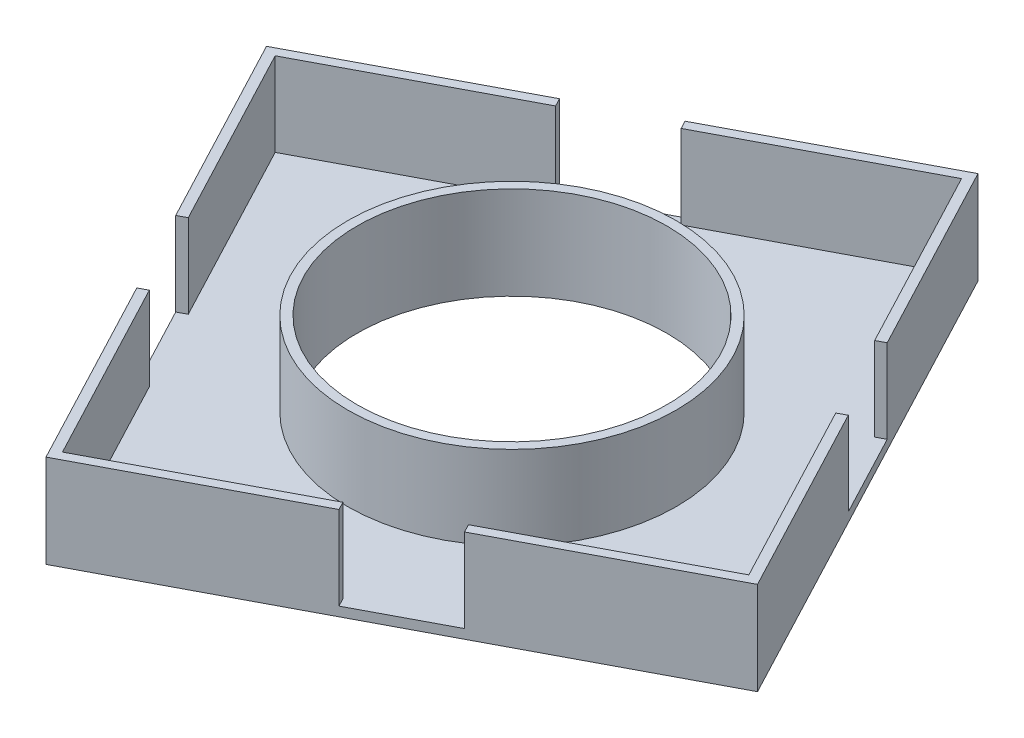
ISO-10303-21;
HEADER;
FILE_DESCRIPTION(('STEP AP214'),'2;1');
FILE_NAME('part.step','',(''),(''),'','','');
FILE_SCHEMA(('AUTOMOTIVE_DESIGN { 1 0 10303 214 1 1 1 1 }'));
ENDSEC;
DATA;
#1=APPLICATION_CONTEXT('core data for automotive mechanical design processes');
#2=APPLICATION_PROTOCOL_DEFINITION('international standard','automotive_design',2000,#1);
#3=PRODUCT_CONTEXT('',#1,'mechanical');
#4=PRODUCT('Part','Part','',(#3));
#5=PRODUCT_RELATED_PRODUCT_CATEGORY('part','',(#4));
#6=PRODUCT_DEFINITION_FORMATION('','',#4);
#7=PRODUCT_DEFINITION_CONTEXT('part definition',#1,'design');
#8=PRODUCT_DEFINITION('design','',#6,#7);
#9=PRODUCT_DEFINITION_SHAPE('','',#8);
#10=(LENGTH_UNIT() NAMED_UNIT(*) SI_UNIT(.MILLI.,.METRE.));
#11=(NAMED_UNIT(*) PLANE_ANGLE_UNIT() SI_UNIT($,.RADIAN.));
#12=(NAMED_UNIT(*) SI_UNIT($,.STERADIAN.) SOLID_ANGLE_UNIT());
#13=UNCERTAINTY_MEASURE_WITH_UNIT(LENGTH_MEASURE(1.E-05),#10,'distance_accuracy_value','');
#14=(GEOMETRIC_REPRESENTATION_CONTEXT(3) GLOBAL_UNCERTAINTY_ASSIGNED_CONTEXT((#13)) GLOBAL_UNIT_ASSIGNED_CONTEXT((#10,
#11,#12)) REPRESENTATION_CONTEXT('',''));
#15=CARTESIAN_POINT('',(0.,0.,0.));
#16=DIRECTION('',(0.,0.,1.));
#17=DIRECTION('',(1.,0.,0.));
#18=AXIS2_PLACEMENT_3D('',#15,#16,#17);
#19=CARTESIAN_POINT('',(0.,30.,0.));
#20=DIRECTION('',(0.,1.,0.));
#21=DIRECTION('',(0.,0.,1.));
#22=AXIS2_PLACEMENT_3D('',#19,#20,#21);
#23=PLANE('',#22);
#24=DIRECTION('',(0.466105526210317,0.,0.884729132806309));
#25=VECTOR('',#24,1.);
#26=CARTESIAN_POINT('',(24.9497161571522,30.,79.539371783273));
#27=LINE('',#26,#25);
#28=CARTESIAN_POINT('',(24.9497161571522,30.,79.539371783273));
#29=VERTEX_POINT('',#28);
#30=CARTESIAN_POINT('',(26.3480327357832,30.,82.193559181692));
#31=VERTEX_POINT('',#30);
#32=EDGE_CURVE('E213',#29,#31,#27,.T.);
#33=ORIENTED_EDGE('',*,*,#32,.F.);
#34=DIRECTION('',(0.884729132806305,0.,-0.466105526210324));
#35=VECTOR('',#34,1.);
#36=CARTESIAN_POINT('',(-36.9813231392899,30.,112.166758617996));
#37=LINE('',#36,#35);
#38=CARTESIAN_POINT('',(-34.327135740871,30.,110.768442039365));
#39=VERTEX_POINT('',#38);
#40=EDGE_CURVE('E333',#39,#29,#37,.T.);
#41=ORIENTED_EDGE('',*,*,#40,.F.);
#42=DIRECTION('',(0.466105526210324,0.,0.884729132806305));
#43=VECTOR('',#42,1.);
#44=CARTESIAN_POINT('',(-112.166758617996,30.,-36.9813231392899));
#45=LINE('',#44,#43);
#46=CARTESIAN_POINT('',(-65.5562059969636,30.,51.4915901413412));
#47=VERTEX_POINT('',#46);
#48=EDGE_CURVE('E345',#47,#39,#45,.T.);
#49=ORIENTED_EDGE('',*,*,#48,.F.);
#50=DIRECTION('',(0.88472913280631,0.,-0.466105526210316));
#51=VECTOR('',#50,1.);
#52=CARTESIAN_POINT('',(-68.2103933953825,30.,52.8899067199722));
#53=LINE('',#52,#51);
#54=CARTESIAN_POINT('',(-68.2103933953825,30.,52.8899067199722));
#55=VERTEX_POINT('',#54);
#56=EDGE_CURVE('E251',#55,#47,#53,.T.);
#57=ORIENTED_EDGE('',*,*,#56,.F.);
#58=DIRECTION('',(0.466105526210324,0.,0.884729132806305));
#59=VECTOR('',#58,1.);
#60=CARTESIAN_POINT('',(-114.820946016415,30.,-35.5830065606589));
#61=LINE('',#60,#59);
#62=CARTESIAN_POINT('',(-35.5830065606589,30.,114.820946016415));
#63=VERTEX_POINT('',#62);
#64=EDGE_CURVE('E368',#55,#63,#61,.T.);
#65=ORIENTED_EDGE('',*,*,#64,.T.);
#66=DIRECTION('',(0.884729132806305,0.,-0.466105526210324));
#67=VECTOR('',#66,1.);
#68=CARTESIAN_POINT('',(-35.5830065606589,30.,114.820946016415));
#69=LINE('',#68,#67);
#70=EDGE_CURVE('E373',#63,#31,#69,.T.);
#71=ORIENTED_EDGE('',*,*,#70,.T.);
#72=EDGE_LOOP('',(#33,#41,#49,#57,#65,#71));
#73=FACE_BOUND('',#72,.T.);
#74=ADVANCED_FACE('F48',(#73),#23,.T.);
#75=DIRECTION('',(-0.884729132806309,0.,0.466105526210317));
#76=VECTOR('',#75,1.);
#77=CARTESIAN_POINT('',(-79.5393717832731,30.,24.949716157152));
#78=LINE('',#77,#76);
#79=CARTESIAN_POINT('',(-79.5393717832731,30.,24.949716157152));
#80=VERTEX_POINT('',#79);
#81=CARTESIAN_POINT('',(-82.193559181692,30.,26.3480327357829));
#82=VERTEX_POINT('',#81);
#83=EDGE_CURVE('E255',#80,#82,#78,.T.);
#84=ORIENTED_EDGE('',*,*,#83,.F.);
#85=CARTESIAN_POINT('',(-110.768442039365,30.,-34.327135740871));
#86=VERTEX_POINT('',#85);
#87=EDGE_CURVE('E346',#86,#80,#45,.T.);
#88=ORIENTED_EDGE('',*,*,#87,.F.);
#89=DIRECTION('',(-0.884729132806305,0.,0.466105526210324));
#90=VECTOR('',#89,1.);
#91=CARTESIAN_POINT('',(36.9813231392899,30.,-112.166758617996));
#92=LINE('',#91,#90);
#93=CARTESIAN_POINT('',(-51.491590141341,30.,-65.5562059969637));
#94=VERTEX_POINT('',#93);
#95=EDGE_CURVE('E341',#94,#86,#92,.T.);
#96=ORIENTED_EDGE('',*,*,#95,.F.);
#97=DIRECTION('',(0.466105526210314,0.,0.88472913280631));
#98=VECTOR('',#97,1.);
#99=CARTESIAN_POINT('',(-52.8899067199719,30.,-68.2103933953827));
#100=LINE('',#99,#98);
#101=CARTESIAN_POINT('',(-52.8899067199719,30.,-68.2103933953827));
#102=VERTEX_POINT('',#101);
#103=EDGE_CURVE('E271',#102,#94,#100,.T.);
#104=ORIENTED_EDGE('',*,*,#103,.F.);
#105=DIRECTION('',(-0.884729132806305,0.,0.466105526210324));
#106=VECTOR('',#105,1.);
#107=CARTESIAN_POINT('',(35.5830065606589,30.,-114.820946016415));
#108=LINE('',#107,#106);
#109=CARTESIAN_POINT('',(-114.820946016415,30.,-35.5830065606589));
#110=VERTEX_POINT('',#109);
#111=EDGE_CURVE('E363',#102,#110,#108,.T.);
#112=ORIENTED_EDGE('',*,*,#111,.T.);
#113=EDGE_CURVE('E369',#110,#82,#61,.T.);
#114=ORIENTED_EDGE('',*,*,#113,.T.);
#115=EDGE_LOOP('',(#84,#88,#96,#104,#112,#114));
#116=FACE_BOUND('',#115,.T.);
#117=ADVANCED_FACE('F441',(#116),#23,.T.);
#118=DIRECTION('',(-0.466105526210312,0.,-0.884729132806312));
#119=VECTOR('',#118,1.);
#120=CARTESIAN_POINT('',(-24.9497161571517,30.,-79.5393717832732));
#121=LINE('',#120,#119);
#122=CARTESIAN_POINT('',(-24.9497161571517,30.,-79.5393717832732));
#123=VERTEX_POINT('',#122);
#124=CARTESIAN_POINT('',(-26.3480327357826,30.,-82.1935591816921));
#125=VERTEX_POINT('',#124);
#126=EDGE_CURVE('E275',#123,#125,#121,.T.);
#127=ORIENTED_EDGE('',*,*,#126,.F.);
#128=CARTESIAN_POINT('',(34.3271357408709,30.,-110.768442039365));
#129=VERTEX_POINT('',#128);
#130=EDGE_CURVE('E342',#129,#123,#92,.T.);
#131=ORIENTED_EDGE('',*,*,#130,.F.);
#132=DIRECTION('',(-0.466105526210324,0.,-0.884729132806305));
#133=VECTOR('',#132,1.);
#134=CARTESIAN_POINT('',(112.166758617996,30.,36.9813231392899));
#135=LINE('',#134,#133);
#136=CARTESIAN_POINT('',(65.5562059969632,30.,-51.4915901413417));
#137=VERTEX_POINT('',#136);
#138=EDGE_CURVE('E312',#137,#129,#135,.T.);
#139=ORIENTED_EDGE('',*,*,#138,.F.);
#140=DIRECTION('',(-0.884729132806306,0.,0.466105526210323));
#141=VECTOR('',#140,1.);
#142=CARTESIAN_POINT('',(68.2103933953821,30.,-52.8899067199726));
#143=LINE('',#142,#141);
#144=CARTESIAN_POINT('',(68.2103933953821,30.,-52.8899067199726));
#145=VERTEX_POINT('',#144);
#146=EDGE_CURVE('E290',#145,#137,#143,.T.);
#147=ORIENTED_EDGE('',*,*,#146,.F.);
#148=DIRECTION('',(-0.466105526210324,0.,-0.884729132806305));
#149=VECTOR('',#148,1.);
#150=CARTESIAN_POINT('',(114.820946016415,30.,35.5830065606589));
#151=LINE('',#150,#149);
#152=CARTESIAN_POINT('',(35.5830065606589,30.,-114.820946016415));
#153=VERTEX_POINT('',#152);
#154=EDGE_CURVE('E364',#145,#153,#151,.T.);
#155=ORIENTED_EDGE('',*,*,#154,.T.);
#156=EDGE_CURVE('E365',#153,#125,#108,.T.);
#157=ORIENTED_EDGE('',*,*,#156,.T.);
#158=EDGE_LOOP('',(#127,#131,#139,#147,#155,#157));
#159=FACE_BOUND('',#158,.T.);
#160=ADVANCED_FACE('F447',(#159),#23,.T.);
#161=CARTESIAN_POINT('',(36.9813231392899,30.,-112.166758617996));
#162=DIRECTION('',(0.466105526210324,0.,0.884729132806305));
#163=DIRECTION('',(0.884729132806305,0.,-0.466105526210324));
#164=AXIS2_PLACEMENT_3D('',#161,#162,#163);
#165=PLANE('',#164);
#166=DIRECTION('',(0.,1.,0.));
#167=VECTOR('',#166,1.);
#168=CARTESIAN_POINT('',(-24.9497161571517,3.,-79.5393717832732));
#169=LINE('',#168,#167);
#170=CARTESIAN_POINT('',(-24.9497161571517,3.,-79.5393717832732));
#171=VERTEX_POINT('',#170);
#172=EDGE_CURVE('E257',#171,#123,#169,.T.);
#173=ORIENTED_EDGE('',*,*,#172,.F.);
#174=DIRECTION('',(-0.884729132806305,0.,0.466105526210324));
#175=VECTOR('',#174,1.);
#176=CARTESIAN_POINT('',(36.9813231392899,3.,-112.166758617996));
#177=LINE('',#176,#175);
#178=CARTESIAN_POINT('',(34.3271357408709,3.,-110.768442039365));
#179=VERTEX_POINT('',#178);
#180=EDGE_CURVE('E318',#179,#171,#177,.T.);
#181=ORIENTED_EDGE('',*,*,#180,.F.);
#182=DIRECTION('',(0.,-1.,0.));
#183=VECTOR('',#182,1.);
#184=CARTESIAN_POINT('',(34.3271357408709,30.,-110.768442039365));
#185=LINE('',#184,#183);
#186=EDGE_CURVE('E324',#129,#179,#185,.T.);
#187=ORIENTED_EDGE('',*,*,#186,.F.);
#188=ORIENTED_EDGE('',*,*,#130,.T.);
#189=EDGE_LOOP('',(#173,#181,#187,#188));
#190=FACE_BOUND('',#189,.T.);
#191=ADVANCED_FACE('F468',(#190),#165,.T.);
#192=CARTESIAN_POINT('',(-112.166758617996,30.,-36.9813231392899));
#193=DIRECTION('',(0.884729132806305,0.,-0.466105526210324));
#194=DIRECTION('',(-0.466105526210324,0.,-0.884729132806305));
#195=AXIS2_PLACEMENT_3D('',#192,#193,#194);
#196=PLANE('',#195);
#197=DIRECTION('',(0.,1.,0.));
#198=VECTOR('',#197,1.);
#199=CARTESIAN_POINT('',(-79.5393717832731,3.,24.949716157152));
#200=LINE('',#199,#198);
#201=CARTESIAN_POINT('',(-79.5393717832731,3.,24.949716157152));
#202=VERTEX_POINT('',#201);
#203=EDGE_CURVE('E238',#202,#80,#200,.T.);
#204=ORIENTED_EDGE('',*,*,#203,.F.);
#205=DIRECTION('',(0.466105526210324,0.,0.884729132806305));
#206=VECTOR('',#205,1.);
#207=CARTESIAN_POINT('',(-112.166758617996,3.,-36.9813231392899));
#208=LINE('',#207,#206);
#209=CARTESIAN_POINT('',(-110.768442039365,3.,-34.327135740871));
#210=VERTEX_POINT('',#209);
#211=EDGE_CURVE('E314',#210,#202,#208,.T.);
#212=ORIENTED_EDGE('',*,*,#211,.F.);
#213=DIRECTION('',(0.,-1.,0.));
#214=VECTOR('',#213,1.);
#215=CARTESIAN_POINT('',(-110.768442039365,30.,-34.327135740871));
#216=LINE('',#215,#214);
#217=EDGE_CURVE('E328',#86,#210,#216,.T.);
#218=ORIENTED_EDGE('',*,*,#217,.F.);
#219=ORIENTED_EDGE('',*,*,#87,.T.);
#220=EDGE_LOOP('',(#204,#212,#218,#219));
#221=FACE_BOUND('',#220,.T.);
#222=ADVANCED_FACE('F473',(#221),#196,.T.);
#223=CARTESIAN_POINT('',(-36.9813231392899,30.,112.166758617996));
#224=DIRECTION('',(-0.466105526210324,0.,-0.884729132806305));
#225=DIRECTION('',(-0.884729132806305,0.,0.466105526210324));
#226=AXIS2_PLACEMENT_3D('',#223,#224,#225);
#227=PLANE('',#226);
#228=DIRECTION('',(0.,1.,0.));
#229=VECTOR('',#228,1.);
#230=CARTESIAN_POINT('',(24.9497161571522,3.,79.539371783273));
#231=LINE('',#230,#229);
#232=CARTESIAN_POINT('',(24.9497161571522,3.,79.539371783273));
#233=VERTEX_POINT('',#232);
#234=EDGE_CURVE('E240',#233,#29,#231,.T.);
#235=ORIENTED_EDGE('',*,*,#234,.F.);
#236=DIRECTION('',(0.884729132806305,0.,-0.466105526210324));
#237=VECTOR('',#236,1.);
#238=CARTESIAN_POINT('',(-36.9813231392899,3.,112.166758617996));
#239=LINE('',#238,#237);
#240=CARTESIAN_POINT('',(-34.327135740871,3.,110.768442039365));
#241=VERTEX_POINT('',#240);
#242=EDGE_CURVE('E229',#241,#233,#239,.T.);
#243=ORIENTED_EDGE('',*,*,#242,.F.);
#244=DIRECTION('',(0.,-1.,0.));
#245=VECTOR('',#244,1.);
#246=CARTESIAN_POINT('',(-34.327135740871,30.,110.768442039365));
#247=LINE('',#246,#245);
#248=EDGE_CURVE('E332',#39,#241,#247,.T.);
#249=ORIENTED_EDGE('',*,*,#248,.F.);
#250=ORIENTED_EDGE('',*,*,#40,.T.);
#251=EDGE_LOOP('',(#235,#243,#249,#250));
#252=FACE_BOUND('',#251,.T.);
#253=ADVANCED_FACE('F462',(#252),#227,.T.);
#254=CARTESIAN_POINT('',(112.166758617996,30.,36.9813231392899));
#255=DIRECTION('',(-0.884729132806305,0.,0.466105526210324));
#256=DIRECTION('',(0.466105526210324,0.,0.884729132806305));
#257=AXIS2_PLACEMENT_3D('',#254,#255,#256);
#258=PLANE('',#257);
#259=DIRECTION('',(0.,1.,0.));
#260=VECTOR('',#259,1.);
#261=CARTESIAN_POINT('',(65.5562059969632,3.,-51.4915901413417));
#262=LINE('',#261,#260);
#263=CARTESIAN_POINT('',(65.5562059969632,3.,-51.4915901413417));
#264=VERTEX_POINT('',#263);
#265=EDGE_CURVE('E297',#264,#137,#262,.T.);
#266=ORIENTED_EDGE('',*,*,#265,.T.);
#267=ORIENTED_EDGE('',*,*,#138,.T.);
#268=ORIENTED_EDGE('',*,*,#186,.T.);
#269=DIRECTION('',(-0.466105526210324,0.,-0.884729132806305));
#270=VECTOR('',#269,1.);
#271=CARTESIAN_POINT('',(112.166758617996,3.,36.9813231392899));
#272=LINE('',#271,#270);
#273=EDGE_CURVE('E310',#264,#179,#272,.T.);
#274=ORIENTED_EDGE('',*,*,#273,.F.);
#275=EDGE_LOOP('',(#266,#267,#268,#274));
#276=FACE_BOUND('',#275,.T.);
#277=ADVANCED_FACE('F457',(#276),#258,.T.);
#278=CARTESIAN_POINT('',(0.,30.,0.));
#279=DIRECTION('',(0.,1.,0.));
#280=DIRECTION('',(0.,0.,1.));
#281=AXIS2_PLACEMENT_3D('',#278,#279,#280);
#282=CIRCLE('',#281,50.);
#283=CARTESIAN_POINT('',(0.,30.,50.));
#284=VERTEX_POINT('',#283);
#285=EDGE_CURVE('E354',#284,#284,#282,.T.);
#286=ORIENTED_EDGE('',*,*,#285,.F.);
#287=EDGE_LOOP('',(#286));
#288=FACE_BOUND('',#287,.T.);
#289=CARTESIAN_POINT('',(0.,30.,0.));
#290=DIRECTION('',(0.,1.,0.));
#291=DIRECTION('',(0.,0.,1.));
#292=AXIS2_PLACEMENT_3D('',#289,#290,#291);
#293=CIRCLE('',#292,53.);
#294=CARTESIAN_POINT('',(0.,30.,53.));
#295=VERTEX_POINT('',#294);
#296=EDGE_CURVE('E323',#295,#295,#293,.T.);
#297=ORIENTED_EDGE('',*,*,#296,.T.);
#298=EDGE_LOOP('',(#297));
#299=FACE_BOUND('',#298,.T.);
#300=ADVANCED_FACE('F452',(#288,#299),#23,.T.);
#301=DIRECTION('',(-0.466105526210321,0.,-0.884729132806307));
#302=VECTOR('',#301,1.);
#303=CARTESIAN_POINT('',(52.8899067199724,30.,68.2103933953823));
#304=LINE('',#303,#302);
#305=CARTESIAN_POINT('',(52.8899067199724,30.,68.2103933953823));
#306=VERTEX_POINT('',#305);
#307=CARTESIAN_POINT('',(51.4915901413414,30.,65.5562059969634));
#308=VERTEX_POINT('',#307);
#309=EDGE_CURVE('E230',#306,#308,#304,.T.);
#310=ORIENTED_EDGE('',*,*,#309,.F.);
#311=CARTESIAN_POINT('',(114.820946016415,30.,35.5830065606589));
#312=VERTEX_POINT('',#311);
#313=EDGE_CURVE('E372',#306,#312,#69,.T.);
#314=ORIENTED_EDGE('',*,*,#313,.T.);
#315=CARTESIAN_POINT('',(82.1935591816919,30.,-26.3480327357835));
#316=VERTEX_POINT('',#315);
#317=EDGE_CURVE('E360',#312,#316,#151,.T.);
#318=ORIENTED_EDGE('',*,*,#317,.T.);
#319=DIRECTION('',(0.884729132806307,0.,-0.466105526210321));
#320=VECTOR('',#319,1.);
#321=CARTESIAN_POINT('',(79.5393717832729,30.,-24.9497161571525));
#322=LINE('',#321,#320);
#323=CARTESIAN_POINT('',(79.5393717832729,30.,-24.9497161571525));
#324=VERTEX_POINT('',#323);
#325=EDGE_CURVE('E242',#324,#316,#322,.T.);
#326=ORIENTED_EDGE('',*,*,#325,.F.);
#327=CARTESIAN_POINT('',(110.768442039365,30.,34.327135740871));
#328=VERTEX_POINT('',#327);
#329=EDGE_CURVE('E338',#328,#324,#135,.T.);
#330=ORIENTED_EDGE('',*,*,#329,.F.);
#331=EDGE_CURVE('E349',#308,#328,#37,.T.);
#332=ORIENTED_EDGE('',*,*,#331,.F.);
#333=EDGE_LOOP('',(#310,#314,#318,#326,#330,#332));
#334=FACE_BOUND('',#333,.T.);
#335=ADVANCED_FACE('F412',(#334),#23,.T.);
#336=CARTESIAN_POINT('',(0.,0.,0.));
#337=DIRECTION('',(0.,1.,0.));
#338=DIRECTION('',(0.,0.,1.));
#339=AXIS2_PLACEMENT_3D('',#336,#337,#338);
#340=PLANE('',#339);
#341=DIRECTION('',(-0.466105526210324,0.,-0.884729132806305));
#342=VECTOR('',#341,1.);
#343=CARTESIAN_POINT('',(114.820946016415,0.,35.5830065606589));
#344=LINE('',#343,#342);
#345=CARTESIAN_POINT('',(114.820946016415,0.,35.5830065606589));
#346=VERTEX_POINT('',#345);
#347=CARTESIAN_POINT('',(35.5830065606589,0.,-114.820946016415));
#348=VERTEX_POINT('',#347);
#349=EDGE_CURVE('E357',#346,#348,#344,.T.);
#350=ORIENTED_EDGE('',*,*,#349,.F.);
#351=DIRECTION('',(0.884729132806305,0.,-0.466105526210324));
#352=VECTOR('',#351,1.);
#353=CARTESIAN_POINT('',(-35.5830065606589,0.,114.820946016415));
#354=LINE('',#353,#352);
#355=CARTESIAN_POINT('',(-35.5830065606589,0.,114.820946016415));
#356=VERTEX_POINT('',#355);
#357=EDGE_CURVE('E382',#356,#346,#354,.T.);
#358=ORIENTED_EDGE('',*,*,#357,.F.);
#359=DIRECTION('',(0.466105526210324,0.,0.884729132806305));
#360=VECTOR('',#359,1.);
#361=CARTESIAN_POINT('',(-114.820946016415,0.,-35.5830065606589));
#362=LINE('',#361,#360);
#363=CARTESIAN_POINT('',(-114.820946016415,0.,-35.5830065606589));
#364=VERTEX_POINT('',#363);
#365=EDGE_CURVE('E380',#364,#356,#362,.T.);
#366=ORIENTED_EDGE('',*,*,#365,.F.);
#367=DIRECTION('',(-0.884729132806305,0.,0.466105526210324));
#368=VECTOR('',#367,1.);
#369=CARTESIAN_POINT('',(35.5830065606589,0.,-114.820946016415));
#370=LINE('',#369,#368);
#371=EDGE_CURVE('E378',#348,#364,#370,.T.);
#372=ORIENTED_EDGE('',*,*,#371,.F.);
#373=EDGE_LOOP('',(#350,#358,#366,#372));
#374=FACE_BOUND('',#373,.T.);
#375=CARTESIAN_POINT('',(0.,0.,0.));
#376=DIRECTION('',(0.,1.,0.));
#377=DIRECTION('',(0.,0.,1.));
#378=AXIS2_PLACEMENT_3D('',#375,#376,#377);
#379=CIRCLE('',#378,50.);
#380=CARTESIAN_POINT('',(0.,0.,50.));
#381=VERTEX_POINT('',#380);
#382=EDGE_CURVE('E327',#381,#381,#379,.T.);
#383=ORIENTED_EDGE('',*,*,#382,.T.);
#384=EDGE_LOOP('',(#383));
#385=FACE_BOUND('',#384,.T.);
#386=ADVANCED_FACE('F401',(#374,#385),#340,.F.);
#387=CARTESIAN_POINT('',(114.820946016415,30.,35.5830065606589));
#388=DIRECTION('',(-0.884729132806305,0.,0.466105526210324));
#389=DIRECTION('',(0.466105526210324,0.,0.884729132806305));
#390=AXIS2_PLACEMENT_3D('',#387,#388,#389);
#391=PLANE('',#390);
#392=ORIENTED_EDGE('',*,*,#154,.F.);
#393=DIRECTION('',(0.,1.,0.));
#394=VECTOR('',#393,1.);
#395=CARTESIAN_POINT('',(68.2103933953821,3.,-52.8899067199726));
#396=LINE('',#395,#394);
#397=CARTESIAN_POINT('',(68.2103933953821,3.,-52.8899067199726));
#398=VERTEX_POINT('',#397);
#399=EDGE_CURVE('E301',#398,#145,#396,.T.);
#400=ORIENTED_EDGE('',*,*,#399,.F.);
#401=DIRECTION('',(-0.466105526210324,0.,-0.884729132806305));
#402=VECTOR('',#401,1.);
#403=CARTESIAN_POINT('',(82.1935591816919,3.,-26.3480327357835));
#404=LINE('',#403,#402);
#405=CARTESIAN_POINT('',(82.1935591816919,3.,-26.3480327357835));
#406=VERTEX_POINT('',#405);
#407=EDGE_CURVE('E289',#406,#398,#404,.T.);
#408=ORIENTED_EDGE('',*,*,#407,.F.);
#409=DIRECTION('',(0.,1.,0.));
#410=VECTOR('',#409,1.);
#411=CARTESIAN_POINT('',(82.1935591816919,3.,-26.3480327357835));
#412=LINE('',#411,#410);
#413=EDGE_CURVE('E303',#406,#316,#412,.T.);
#414=ORIENTED_EDGE('',*,*,#413,.T.);
#415=ORIENTED_EDGE('',*,*,#317,.F.);
#416=DIRECTION('',(0.,-1.,0.));
#417=VECTOR('',#416,1.);
#418=CARTESIAN_POINT('',(114.820946016415,30.,35.5830065606589));
#419=LINE('',#418,#417);
#420=EDGE_CURVE('E375',#312,#346,#419,.T.);
#421=ORIENTED_EDGE('',*,*,#420,.T.);
#422=ORIENTED_EDGE('',*,*,#349,.T.);
#423=DIRECTION('',(0.,-1.,0.));
#424=VECTOR('',#423,1.);
#425=CARTESIAN_POINT('',(35.5830065606589,30.,-114.820946016415));
#426=LINE('',#425,#424);
#427=EDGE_CURVE('E12',#153,#348,#426,.T.);
#428=ORIENTED_EDGE('',*,*,#427,.F.);
#429=EDGE_LOOP('',(#392,#400,#408,#414,#415,#421,#422,#428));
#430=FACE_BOUND('',#429,.T.);
#431=ADVANCED_FACE('F50',(#430),#391,.F.);
#432=CARTESIAN_POINT('',(35.5830065606589,30.,-114.820946016415));
#433=DIRECTION('',(0.466105526210324,0.,0.884729132806305));
#434=DIRECTION('',(0.884729132806305,0.,-0.466105526210324));
#435=AXIS2_PLACEMENT_3D('',#432,#433,#434);
#436=PLANE('',#435);
#437=DIRECTION('',(-0.88472913280631,0.,0.466105526210315));
#438=VECTOR('',#437,1.);
#439=CARTESIAN_POINT('',(-26.3480327357826,3.,-82.1935591816921));
#440=LINE('',#439,#438);
#441=CARTESIAN_POINT('',(-26.3480327357826,3.,-82.1935591816921));
#442=VERTEX_POINT('',#441);
#443=CARTESIAN_POINT('',(-52.8899067199719,3.,-68.2103933953827));
#444=VERTEX_POINT('',#443);
#445=EDGE_CURVE('E270',#442,#444,#440,.T.);
#446=ORIENTED_EDGE('',*,*,#445,.F.);
#447=DIRECTION('',(0.,1.,0.));
#448=VECTOR('',#447,1.);
#449=CARTESIAN_POINT('',(-26.3480327357826,3.,-82.1935591816921));
#450=LINE('',#449,#448);
#451=EDGE_CURVE('E274',#442,#125,#450,.T.);
#452=ORIENTED_EDGE('',*,*,#451,.T.);
#453=ORIENTED_EDGE('',*,*,#156,.F.);
#454=ORIENTED_EDGE('',*,*,#427,.T.);
#455=ORIENTED_EDGE('',*,*,#371,.T.);
#456=DIRECTION('',(0.,-1.,0.));
#457=VECTOR('',#456,1.);
#458=CARTESIAN_POINT('',(-114.820946016415,30.,-35.5830065606589));
#459=LINE('',#458,#457);
#460=EDGE_CURVE('E56',#110,#364,#459,.T.);
#461=ORIENTED_EDGE('',*,*,#460,.F.);
#462=ORIENTED_EDGE('',*,*,#111,.F.);
#463=DIRECTION('',(0.,1.,0.));
#464=VECTOR('',#463,1.);
#465=CARTESIAN_POINT('',(-52.8899067199719,3.,-68.2103933953827));
#466=LINE('',#465,#464);
#467=EDGE_CURVE('E282',#444,#102,#466,.T.);
#468=ORIENTED_EDGE('',*,*,#467,.F.);
#469=EDGE_LOOP('',(#446,#452,#453,#454,#455,#461,#462,#468));
#470=FACE_BOUND('',#469,.T.);
#471=ADVANCED_FACE('F490',(#470),#436,.F.);
#472=CARTESIAN_POINT('',(-114.820946016415,30.,-35.5830065606589));
#473=DIRECTION('',(0.884729132806305,0.,-0.466105526210324));
#474=DIRECTION('',(-0.466105526210324,0.,-0.884729132806305));
#475=AXIS2_PLACEMENT_3D('',#472,#473,#474);
#476=PLANE('',#475);
#477=DIRECTION('',(0.466105526210318,0.,0.884729132806308));
#478=VECTOR('',#477,1.);
#479=CARTESIAN_POINT('',(-82.193559181692,3.,26.3480327357829));
#480=LINE('',#479,#478);
#481=CARTESIAN_POINT('',(-82.193559181692,3.,26.3480327357829));
#482=VERTEX_POINT('',#481);
#483=CARTESIAN_POINT('',(-68.2103933953825,3.,52.8899067199722));
#484=VERTEX_POINT('',#483);
#485=EDGE_CURVE('E250',#482,#484,#480,.T.);
#486=ORIENTED_EDGE('',*,*,#485,.F.);
#487=DIRECTION('',(0.,1.,0.));
#488=VECTOR('',#487,1.);
#489=CARTESIAN_POINT('',(-82.193559181692,3.,26.3480327357829));
#490=LINE('',#489,#488);
#491=EDGE_CURVE('E254',#482,#82,#490,.T.);
#492=ORIENTED_EDGE('',*,*,#491,.T.);
#493=ORIENTED_EDGE('',*,*,#113,.F.);
#494=ORIENTED_EDGE('',*,*,#460,.T.);
#495=ORIENTED_EDGE('',*,*,#365,.T.);
#496=DIRECTION('',(0.,-1.,0.));
#497=VECTOR('',#496,1.);
#498=CARTESIAN_POINT('',(-35.5830065606589,30.,114.820946016415));
#499=LINE('',#498,#497);
#500=EDGE_CURVE('E386',#63,#356,#499,.T.);
#501=ORIENTED_EDGE('',*,*,#500,.F.);
#502=ORIENTED_EDGE('',*,*,#64,.F.);
#503=DIRECTION('',(0.,1.,0.));
#504=VECTOR('',#503,1.);
#505=CARTESIAN_POINT('',(-68.2103933953825,3.,52.8899067199722));
#506=LINE('',#505,#504);
#507=EDGE_CURVE('E263',#484,#55,#506,.T.);
#508=ORIENTED_EDGE('',*,*,#507,.F.);
#509=EDGE_LOOP('',(#486,#492,#493,#494,#495,#501,#502,#508));
#510=FACE_BOUND('',#509,.T.);
#511=ADVANCED_FACE('F394',(#510),#476,.F.);
#512=CARTESIAN_POINT('',(-35.5830065606589,30.,114.820946016415));
#513=DIRECTION('',(-0.466105526210324,0.,-0.884729132806305));
#514=DIRECTION('',(-0.884729132806305,0.,0.466105526210324));
#515=AXIS2_PLACEMENT_3D('',#512,#513,#514);
#516=PLANE('',#515);
#517=DIRECTION('',(0.884729132806307,0.,-0.466105526210321));
#518=VECTOR('',#517,1.);
#519=CARTESIAN_POINT('',(26.3480327357832,3.,82.193559181692));
#520=LINE('',#519,#518);
#521=CARTESIAN_POINT('',(26.3480327357832,3.,82.193559181692));
#522=VERTEX_POINT('',#521);
#523=CARTESIAN_POINT('',(52.8899067199724,3.,68.2103933953823));
#524=VERTEX_POINT('',#523);
#525=EDGE_CURVE('E226',#522,#524,#520,.T.);
#526=ORIENTED_EDGE('',*,*,#525,.F.);
#527=DIRECTION('',(0.,1.,0.));
#528=VECTOR('',#527,1.);
#529=CARTESIAN_POINT('',(26.3480327357832,3.,82.193559181692));
#530=LINE('',#529,#528);
#531=EDGE_CURVE('E207',#522,#31,#530,.T.);
#532=ORIENTED_EDGE('',*,*,#531,.T.);
#533=ORIENTED_EDGE('',*,*,#70,.F.);
#534=ORIENTED_EDGE('',*,*,#500,.T.);
#535=ORIENTED_EDGE('',*,*,#357,.T.);
#536=ORIENTED_EDGE('',*,*,#420,.F.);
#537=ORIENTED_EDGE('',*,*,#313,.F.);
#538=DIRECTION('',(0.,1.,0.));
#539=VECTOR('',#538,1.);
#540=CARTESIAN_POINT('',(52.8899067199724,3.,68.2103933953823));
#541=LINE('',#540,#539);
#542=EDGE_CURVE('E218',#524,#306,#541,.T.);
#543=ORIENTED_EDGE('',*,*,#542,.F.);
#544=EDGE_LOOP('',(#526,#532,#533,#534,#535,#536,#537,#543));
#545=FACE_BOUND('',#544,.T.);
#546=ADVANCED_FACE('F232',(#545),#516,.F.);
#547=CARTESIAN_POINT('',(0.,30.,0.));
#548=DIRECTION('',(0.,-1.,0.));
#549=DIRECTION('',(0.,0.,-1.));
#550=AXIS2_PLACEMENT_3D('',#547,#548,#549);
#551=CYLINDRICAL_SURFACE('',#550,50.);
#552=ORIENTED_EDGE('',*,*,#285,.T.);
#553=EDGE_LOOP('',(#552));
#554=FACE_BOUND('',#553,.T.);
#555=ORIENTED_EDGE('',*,*,#382,.F.);
#556=EDGE_LOOP('',(#555));
#557=FACE_BOUND('',#556,.T.);
#558=ADVANCED_FACE('F537',(#554,#557),#551,.F.);
#559=CARTESIAN_POINT('',(0.,3.,0.));
#560=DIRECTION('',(0.,1.,0.));
#561=DIRECTION('',(0.,0.,1.));
#562=AXIS2_PLACEMENT_3D('',#559,#560,#561);
#563=PLANE('',#562);
#564=CARTESIAN_POINT('',(110.768442039365,3.,34.327135740871));
#565=VERTEX_POINT('',#564);
#566=CARTESIAN_POINT('',(79.5393717832729,3.,-24.9497161571525));
#567=VERTEX_POINT('',#566);
#568=EDGE_CURVE('E307',#565,#567,#272,.T.);
#569=ORIENTED_EDGE('',*,*,#568,.T.);
#570=DIRECTION('',(0.884729132806307,0.,-0.466105526210321));
#571=VECTOR('',#570,1.);
#572=CARTESIAN_POINT('',(79.5393717832729,3.,-24.9497161571525));
#573=LINE('',#572,#571);
#574=EDGE_CURVE('E286',#567,#406,#573,.T.);
#575=ORIENTED_EDGE('',*,*,#574,.T.);
#576=ORIENTED_EDGE('',*,*,#407,.T.);
#577=DIRECTION('',(-0.884729132806306,0.,0.466105526210323));
#578=VECTOR('',#577,1.);
#579=CARTESIAN_POINT('',(68.2103933953821,3.,-52.8899067199726));
#580=LINE('',#579,#578);
#581=EDGE_CURVE('E292',#398,#264,#580,.T.);
#582=ORIENTED_EDGE('',*,*,#581,.T.);
#583=ORIENTED_EDGE('',*,*,#273,.T.);
#584=ORIENTED_EDGE('',*,*,#180,.T.);
#585=DIRECTION('',(-0.466105526210312,0.,-0.884729132806312));
#586=VECTOR('',#585,1.);
#587=CARTESIAN_POINT('',(-24.9497161571517,3.,-79.5393717832732));
#588=LINE('',#587,#586);
#589=EDGE_CURVE('E267',#171,#442,#588,.T.);
#590=ORIENTED_EDGE('',*,*,#589,.T.);
#591=ORIENTED_EDGE('',*,*,#445,.T.);
#592=DIRECTION('',(0.466105526210314,0.,0.88472913280631));
#593=VECTOR('',#592,1.);
#594=CARTESIAN_POINT('',(-52.8899067199719,3.,-68.2103933953827));
#595=LINE('',#594,#593);
#596=CARTESIAN_POINT('',(-51.4915901413407,3.,-65.5562059969637));
#597=VERTEX_POINT('',#596);
#598=EDGE_CURVE('E63',#444,#597,#595,.T.);
#599=ORIENTED_EDGE('',*,*,#598,.T.);
#600=EDGE_CURVE('E309',#597,#210,#177,.T.);
#601=ORIENTED_EDGE('',*,*,#600,.T.);
#602=ORIENTED_EDGE('',*,*,#211,.T.);
#603=DIRECTION('',(-0.884729132806309,0.,0.466105526210317));
#604=VECTOR('',#603,1.);
#605=CARTESIAN_POINT('',(-79.5393717832731,3.,24.949716157152));
#606=LINE('',#605,#604);
#607=EDGE_CURVE('E247',#202,#482,#606,.T.);
#608=ORIENTED_EDGE('',*,*,#607,.T.);
#609=ORIENTED_EDGE('',*,*,#485,.T.);
#610=DIRECTION('',(0.88472913280631,0.,-0.466105526210316));
#611=VECTOR('',#610,1.);
#612=CARTESIAN_POINT('',(-68.2103933953825,3.,52.8899067199722));
#613=LINE('',#612,#611);
#614=CARTESIAN_POINT('',(-65.5562059969636,3.,51.4915901413411));
#615=VERTEX_POINT('',#614);
#616=EDGE_CURVE('E70',#484,#615,#613,.T.);
#617=ORIENTED_EDGE('',*,*,#616,.T.);
#618=EDGE_CURVE('E317',#615,#241,#208,.T.);
#619=ORIENTED_EDGE('',*,*,#618,.T.);
#620=ORIENTED_EDGE('',*,*,#242,.T.);
#621=DIRECTION('',(0.466105526210317,0.,0.884729132806309));
#622=VECTOR('',#621,1.);
#623=CARTESIAN_POINT('',(24.9497161571522,3.,79.539371783273));
#624=LINE('',#623,#622);
#625=EDGE_CURVE('E210',#233,#522,#624,.T.);
#626=ORIENTED_EDGE('',*,*,#625,.T.);
#627=ORIENTED_EDGE('',*,*,#525,.T.);
#628=DIRECTION('',(-0.466105526210321,0.,-0.884729132806307));
#629=VECTOR('',#628,1.);
#630=CARTESIAN_POINT('',(52.8899067199724,3.,68.2103933953823));
#631=LINE('',#630,#629);
#632=CARTESIAN_POINT('',(51.4915901413414,3.,65.5562059969634));
#633=VERTEX_POINT('',#632);
#634=EDGE_CURVE('E219',#524,#633,#631,.T.);
#635=ORIENTED_EDGE('',*,*,#634,.T.);
#636=EDGE_CURVE('E313',#633,#565,#239,.T.);
#637=ORIENTED_EDGE('',*,*,#636,.T.);
#638=EDGE_LOOP('',(#569,#575,#576,#582,#583,#584,#590,#591,#599,#601,#602,#608,#609,#617,#619,
#620,#626,#627,#635,#637));
#639=FACE_BOUND('',#638,.T.);
#640=CARTESIAN_POINT('',(0.,3.,0.));
#641=DIRECTION('',(0.,1.,0.));
#642=DIRECTION('',(0.,0.,1.));
#643=AXIS2_PLACEMENT_3D('',#640,#641,#642);
#644=CIRCLE('',#643,53.);
#645=CARTESIAN_POINT('',(0.,3.,53.));
#646=VERTEX_POINT('',#645);
#647=EDGE_CURVE('E300',#646,#646,#644,.T.);
#648=ORIENTED_EDGE('',*,*,#647,.F.);
#649=EDGE_LOOP('',(#648));
#650=FACE_BOUND('',#649,.T.);
#651=ADVANCED_FACE('F224',(#639,#650),#563,.T.);
#652=DIRECTION('',(0.,1.,0.));
#653=VECTOR('',#652,1.);
#654=CARTESIAN_POINT('',(79.5393717832729,3.,-24.9497161571525));
#655=LINE('',#654,#653);
#656=EDGE_CURVE('E294',#567,#324,#655,.T.);
#657=ORIENTED_EDGE('',*,*,#656,.F.);
#658=ORIENTED_EDGE('',*,*,#568,.F.);
#659=DIRECTION('',(0.,-1.,0.));
#660=VECTOR('',#659,1.);
#661=CARTESIAN_POINT('',(110.768442039365,30.,34.327135740871));
#662=LINE('',#661,#660);
#663=EDGE_CURVE('E329',#328,#565,#662,.T.);
#664=ORIENTED_EDGE('',*,*,#663,.F.);
#665=ORIENTED_EDGE('',*,*,#329,.T.);
#666=EDGE_LOOP('',(#657,#658,#664,#665));
#667=FACE_BOUND('',#666,.T.);
#668=ADVANCED_FACE('F425',(#667),#258,.T.);
#669=DIRECTION('',(0.,1.,0.));
#670=VECTOR('',#669,1.);
#671=CARTESIAN_POINT('',(-51.491590141341,3.,-65.5562059969637));
#672=LINE('',#671,#670);
#673=EDGE_CURVE('E279',#597,#94,#672,.T.);
#674=ORIENTED_EDGE('',*,*,#673,.T.);
#675=ORIENTED_EDGE('',*,*,#95,.T.);
#676=ORIENTED_EDGE('',*,*,#217,.T.);
#677=ORIENTED_EDGE('',*,*,#600,.F.);
#678=EDGE_LOOP('',(#674,#675,#676,#677));
#679=FACE_BOUND('',#678,.T.);
#680=ADVANCED_FACE('F476',(#679),#165,.T.);
#681=DIRECTION('',(0.,1.,0.));
#682=VECTOR('',#681,1.);
#683=CARTESIAN_POINT('',(-65.5562059969636,3.,51.4915901413412));
#684=LINE('',#683,#682);
#685=EDGE_CURVE('E260',#615,#47,#684,.T.);
#686=ORIENTED_EDGE('',*,*,#685,.T.);
#687=ORIENTED_EDGE('',*,*,#48,.T.);
#688=ORIENTED_EDGE('',*,*,#248,.T.);
#689=ORIENTED_EDGE('',*,*,#618,.F.);
#690=EDGE_LOOP('',(#686,#687,#688,#689));
#691=FACE_BOUND('',#690,.T.);
#692=ADVANCED_FACE('F516',(#691),#196,.T.);
#693=DIRECTION('',(0.,1.,0.));
#694=VECTOR('',#693,1.);
#695=CARTESIAN_POINT('',(51.4915901413414,3.,65.5562059969634));
#696=LINE('',#695,#694);
#697=EDGE_CURVE('E243',#633,#308,#696,.T.);
#698=ORIENTED_EDGE('',*,*,#697,.T.);
#699=ORIENTED_EDGE('',*,*,#331,.T.);
#700=ORIENTED_EDGE('',*,*,#663,.T.);
#701=ORIENTED_EDGE('',*,*,#636,.F.);
#702=EDGE_LOOP('',(#698,#699,#700,#701));
#703=FACE_BOUND('',#702,.T.);
#704=ADVANCED_FACE('F420',(#703),#227,.T.);
#705=CARTESIAN_POINT('',(0.,30.,0.));
#706=DIRECTION('',(0.,-1.,0.));
#707=DIRECTION('',(0.,0.,-1.));
#708=AXIS2_PLACEMENT_3D('',#705,#706,#707);
#709=CYLINDRICAL_SURFACE('',#708,53.);
#710=ORIENTED_EDGE('',*,*,#296,.F.);
#711=EDGE_LOOP('',(#710));
#712=FACE_BOUND('',#711,.T.);
#713=ORIENTED_EDGE('',*,*,#647,.T.);
#714=EDGE_LOOP('',(#713));
#715=FACE_BOUND('',#714,.T.);
#716=ADVANCED_FACE('F436',(#712,#715),#709,.T.);
#717=CARTESIAN_POINT('',(68.2103933953821,3.,-52.8899067199726));
#718=DIRECTION('',(-0.466105526210323,0.,-0.884729132806306));
#719=DIRECTION('',(-0.884729132806306,0.,0.466105526210323));
#720=AXIS2_PLACEMENT_3D('',#717,#718,#719);
#721=PLANE('',#720);
#722=ORIENTED_EDGE('',*,*,#146,.T.);
#723=ORIENTED_EDGE('',*,*,#265,.F.);
#724=ORIENTED_EDGE('',*,*,#581,.F.);
#725=ORIENTED_EDGE('',*,*,#399,.T.);
#726=EDGE_LOOP('',(#722,#723,#724,#725));
#727=FACE_BOUND('',#726,.T.);
#728=ADVANCED_FACE('F429',(#727),#721,.F.);
#729=CARTESIAN_POINT('',(79.5393717832729,3.,-24.9497161571525));
#730=DIRECTION('',(0.466105526210321,0.,0.884729132806307));
#731=DIRECTION('',(0.884729132806307,0.,-0.466105526210321));
#732=AXIS2_PLACEMENT_3D('',#729,#730,#731);
#733=PLANE('',#732);
#734=ORIENTED_EDGE('',*,*,#325,.T.);
#735=ORIENTED_EDGE('',*,*,#413,.F.);
#736=ORIENTED_EDGE('',*,*,#574,.F.);
#737=ORIENTED_EDGE('',*,*,#656,.T.);
#738=EDGE_LOOP('',(#734,#735,#736,#737));
#739=FACE_BOUND('',#738,.T.);
#740=ADVANCED_FACE('F427',(#739),#733,.F.);
#741=CARTESIAN_POINT('',(24.9497161571522,3.,79.539371783273));
#742=DIRECTION('',(-0.884729132806309,0.,0.466105526210317));
#743=DIRECTION('',(0.466105526210317,0.,0.884729132806309));
#744=AXIS2_PLACEMENT_3D('',#741,#742,#743);
#745=PLANE('',#744);
#746=ORIENTED_EDGE('',*,*,#32,.T.);
#747=ORIENTED_EDGE('',*,*,#531,.F.);
#748=ORIENTED_EDGE('',*,*,#625,.F.);
#749=ORIENTED_EDGE('',*,*,#234,.T.);
#750=EDGE_LOOP('',(#746,#747,#748,#749));
#751=FACE_BOUND('',#750,.T.);
#752=ADVANCED_FACE('F209',(#751),#745,.F.);
#753=CARTESIAN_POINT('',(52.8899067199724,3.,68.2103933953823));
#754=DIRECTION('',(0.884729132806307,0.,-0.466105526210321));
#755=DIRECTION('',(-0.466105526210321,0.,-0.884729132806307));
#756=AXIS2_PLACEMENT_3D('',#753,#754,#755);
#757=PLANE('',#756);
#758=ORIENTED_EDGE('',*,*,#309,.T.);
#759=ORIENTED_EDGE('',*,*,#697,.F.);
#760=ORIENTED_EDGE('',*,*,#634,.F.);
#761=ORIENTED_EDGE('',*,*,#542,.T.);
#762=EDGE_LOOP('',(#758,#759,#760,#761));
#763=FACE_BOUND('',#762,.T.);
#764=ADVANCED_FACE('F417',(#763),#757,.F.);
#765=CARTESIAN_POINT('',(-79.5393717832731,3.,24.949716157152));
#766=DIRECTION('',(-0.466105526210317,0.,-0.884729132806309));
#767=DIRECTION('',(-0.884729132806309,0.,0.466105526210317));
#768=AXIS2_PLACEMENT_3D('',#765,#766,#767);
#769=PLANE('',#768);
#770=ORIENTED_EDGE('',*,*,#83,.T.);
#771=ORIENTED_EDGE('',*,*,#491,.F.);
#772=ORIENTED_EDGE('',*,*,#607,.F.);
#773=ORIENTED_EDGE('',*,*,#203,.T.);
#774=EDGE_LOOP('',(#770,#771,#772,#773));
#775=FACE_BOUND('',#774,.T.);
#776=ADVANCED_FACE('F651',(#775),#769,.F.);
#777=CARTESIAN_POINT('',(-68.2103933953825,3.,52.8899067199722));
#778=DIRECTION('',(0.466105526210316,0.,0.88472913280631));
#779=DIRECTION('',(0.88472913280631,0.,-0.466105526210316));
#780=AXIS2_PLACEMENT_3D('',#777,#778,#779);
#781=PLANE('',#780);
#782=ORIENTED_EDGE('',*,*,#56,.T.);
#783=ORIENTED_EDGE('',*,*,#685,.F.);
#784=ORIENTED_EDGE('',*,*,#616,.F.);
#785=ORIENTED_EDGE('',*,*,#507,.T.);
#786=EDGE_LOOP('',(#782,#783,#784,#785));
#787=FACE_BOUND('',#786,.T.);
#788=ADVANCED_FACE('F511',(#787),#781,.F.);
#789=CARTESIAN_POINT('',(-24.9497161571517,3.,-79.5393717832732));
#790=DIRECTION('',(0.884729132806312,0.,-0.466105526210312));
#791=DIRECTION('',(-0.466105526210312,0.,-0.884729132806312));
#792=AXIS2_PLACEMENT_3D('',#789,#790,#791);
#793=PLANE('',#792);
#794=ORIENTED_EDGE('',*,*,#126,.T.);
#795=ORIENTED_EDGE('',*,*,#451,.F.);
#796=ORIENTED_EDGE('',*,*,#589,.F.);
#797=ORIENTED_EDGE('',*,*,#172,.T.);
#798=EDGE_LOOP('',(#794,#795,#796,#797));
#799=FACE_BOUND('',#798,.T.);
#800=ADVANCED_FACE('F492',(#799),#793,.F.);
#801=CARTESIAN_POINT('',(-52.8899067199719,3.,-68.2103933953827));
#802=DIRECTION('',(-0.884729132806311,0.,0.466105526210314));
#803=DIRECTION('',(0.466105526210314,0.,0.884729132806311));
#804=AXIS2_PLACEMENT_3D('',#801,#802,#803);
#805=PLANE('',#804);
#806=ORIENTED_EDGE('',*,*,#103,.T.);
#807=ORIENTED_EDGE('',*,*,#673,.F.);
#808=ORIENTED_EDGE('',*,*,#598,.F.);
#809=ORIENTED_EDGE('',*,*,#467,.T.);
#810=EDGE_LOOP('',(#806,#807,#808,#809));
#811=FACE_BOUND('',#810,.T.);
#812=ADVANCED_FACE('F496',(#811),#805,.F.);
#813=CLOSED_SHELL('',(#74,#117,#160,#191,#222,#253,#277,#300,#335,#386,#431,#471,#511,#546,#558,
#651,#668,#680,#692,#704,#716,#728,#740,#752,#764,#776,#788,#800,#812));
#814=MANIFOLD_SOLID_BREP('B2',#813);
#815=ADVANCED_BREP_SHAPE_REPRESENTATION('',(#18,#814),#14);
#816=SHAPE_DEFINITION_REPRESENTATION(#9,#815);
ENDSEC;
END-ISO-10303-21;
